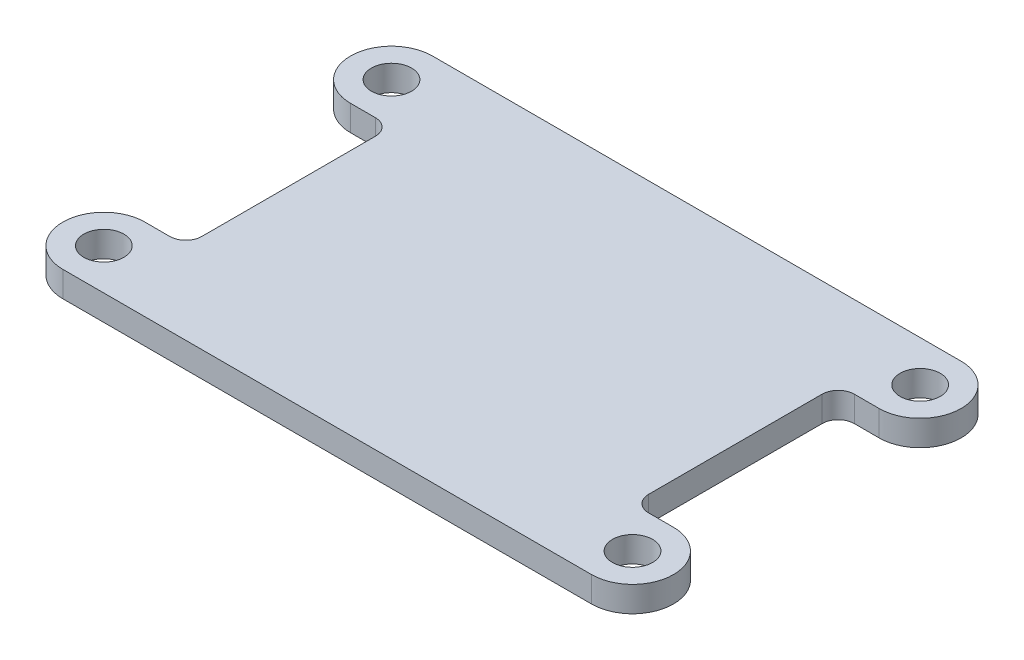
ISO-10303-21;
HEADER;
FILE_DESCRIPTION(('STEP AP214'),'2;1');
FILE_NAME('part.step','',(''),(''),'','','');
FILE_SCHEMA(('AUTOMOTIVE_DESIGN { 1 0 10303 214 1 1 1 1 }'));
ENDSEC;
DATA;
#1=APPLICATION_CONTEXT('core data for automotive mechanical design processes');
#2=APPLICATION_PROTOCOL_DEFINITION('international standard','automotive_design',2000,#1);
#3=PRODUCT_CONTEXT('',#1,'mechanical');
#4=PRODUCT('Part','Part','',(#3));
#5=PRODUCT_RELATED_PRODUCT_CATEGORY('part','',(#4));
#6=PRODUCT_DEFINITION_FORMATION('','',#4);
#7=PRODUCT_DEFINITION_CONTEXT('part definition',#1,'design');
#8=PRODUCT_DEFINITION('design','',#6,#7);
#9=PRODUCT_DEFINITION_SHAPE('','',#8);
#10=(LENGTH_UNIT() NAMED_UNIT(*) SI_UNIT(.MILLI.,.METRE.));
#11=(NAMED_UNIT(*) PLANE_ANGLE_UNIT() SI_UNIT($,.RADIAN.));
#12=(NAMED_UNIT(*) SI_UNIT($,.STERADIAN.) SOLID_ANGLE_UNIT());
#13=UNCERTAINTY_MEASURE_WITH_UNIT(LENGTH_MEASURE(1.E-05),#10,'distance_accuracy_value','');
#14=(GEOMETRIC_REPRESENTATION_CONTEXT(3) GLOBAL_UNCERTAINTY_ASSIGNED_CONTEXT((#13)) GLOBAL_UNIT_ASSIGNED_CONTEXT((#10,
#11,#12)) REPRESENTATION_CONTEXT('',''));
#15=CARTESIAN_POINT('',(0.,0.,0.));
#16=DIRECTION('',(0.,0.,1.));
#17=DIRECTION('',(1.,0.,0.));
#18=AXIS2_PLACEMENT_3D('',#15,#16,#17);
#19=CARTESIAN_POINT('',(0.,1.5875,0.));
#20=DIRECTION('',(0.,-1.,0.));
#21=DIRECTION('',(0.,0.,-1.));
#22=AXIS2_PLACEMENT_3D('',#19,#20,#21);
#23=PLANE('',#22);
#24=CARTESIAN_POINT('',(16.45,1.5875,-8.95));
#25=DIRECTION('',(0.,1.,0.));
#26=DIRECTION('',(0.,0.,1.));
#27=AXIS2_PLACEMENT_3D('',#24,#25,#26);
#28=CIRCLE('',#27,1.25);
#29=CARTESIAN_POINT('',(16.45,1.5875,-7.7));
#30=VERTEX_POINT('',#29);
#31=EDGE_CURVE('E455',#30,#30,#28,.F.);
#32=ORIENTED_EDGE('',*,*,#31,.T.);
#33=EDGE_LOOP('',(#32));
#34=FACE_BOUND('',#33,.T.);
#35=CARTESIAN_POINT('',(16.45,1.5875,8.95));
#36=DIRECTION('',(0.,1.,0.));
#37=DIRECTION('',(0.,0.,1.));
#38=AXIS2_PLACEMENT_3D('',#35,#36,#37);
#39=CIRCLE('',#38,1.25);
#40=CARTESIAN_POINT('',(16.45,1.5875,10.2));
#41=VERTEX_POINT('',#40);
#42=EDGE_CURVE('E402',#41,#41,#39,.F.);
#43=ORIENTED_EDGE('',*,*,#42,.T.);
#44=EDGE_LOOP('',(#43));
#45=FACE_BOUND('',#44,.T.);
#46=CARTESIAN_POINT('',(-16.45,1.5875,8.95));
#47=DIRECTION('',(0.,1.,0.));
#48=DIRECTION('',(0.,0.,1.));
#49=AXIS2_PLACEMENT_3D('',#46,#47,#48);
#50=CIRCLE('',#49,1.25);
#51=CARTESIAN_POINT('',(-16.45,1.5875,10.2));
#52=VERTEX_POINT('',#51);
#53=EDGE_CURVE('E393',#52,#52,#50,.T.);
#54=ORIENTED_EDGE('',*,*,#53,.F.);
#55=EDGE_LOOP('',(#54));
#56=FACE_BOUND('',#55,.T.);
#57=CARTESIAN_POINT('',(-16.45,1.5875,-8.95));
#58=DIRECTION('',(0.,1.,0.));
#59=DIRECTION('',(0.,0.,1.));
#60=AXIS2_PLACEMENT_3D('',#57,#58,#59);
#61=CIRCLE('',#60,1.25);
#62=CARTESIAN_POINT('',(-16.45,1.5875,-7.7));
#63=VERTEX_POINT('',#62);
#64=EDGE_CURVE('E382',#63,#63,#61,.T.);
#65=ORIENTED_EDGE('',*,*,#64,.F.);
#66=EDGE_LOOP('',(#65));
#67=FACE_BOUND('',#66,.T.);
#68=CARTESIAN_POINT('',(16.45,1.5875,-8.95));
#69=DIRECTION('',(0.,1.,0.));
#70=DIRECTION('',(0.,0.,1.));
#71=AXIS2_PLACEMENT_3D('',#68,#69,#70);
#72=CIRCLE('',#71,2.55);
#73=CARTESIAN_POINT('',(16.45,1.5875,-11.5));
#74=VERTEX_POINT('',#73);
#75=CARTESIAN_POINT('',(16.45,1.5875,-6.4));
#76=VERTEX_POINT('',#75);
#77=EDGE_CURVE('E438',#74,#76,#72,.F.);
#78=ORIENTED_EDGE('',*,*,#77,.F.);
#79=DIRECTION('',(-1.,0.,0.));
#80=VECTOR('',#79,1.);
#81=CARTESIAN_POINT('',(-19.,1.5875,-11.5));
#82=LINE('',#81,#80);
#83=CARTESIAN_POINT('',(-16.45,1.5875,-11.5));
#84=VERTEX_POINT('',#83);
#85=EDGE_CURVE('E204',#74,#84,#82,.T.);
#86=ORIENTED_EDGE('',*,*,#85,.T.);
#87=CARTESIAN_POINT('',(-16.45,1.5875,-8.95));
#88=DIRECTION('',(0.,1.,0.));
#89=DIRECTION('',(0.,0.,1.));
#90=AXIS2_PLACEMENT_3D('',#87,#88,#89);
#91=CIRCLE('',#90,2.55);
#92=CARTESIAN_POINT('',(-16.45,1.5875,-6.4));
#93=VERTEX_POINT('',#92);
#94=EDGE_CURVE('E331',#84,#93,#91,.T.);
#95=ORIENTED_EDGE('',*,*,#94,.T.);
#96=DIRECTION('',(1.,0.,0.));
#97=VECTOR('',#96,1.);
#98=CARTESIAN_POINT('',(0.,1.5875,-6.39999999999999));
#99=LINE('',#98,#97);
#100=CARTESIAN_POINT('',(-14.9,1.5875,-6.4));
#101=VERTEX_POINT('',#100);
#102=EDGE_CURVE('E365',#93,#101,#99,.T.);
#103=ORIENTED_EDGE('',*,*,#102,.T.);
#104=CARTESIAN_POINT('',(-14.9,1.5875,-5.4));
#105=DIRECTION('',(0.,1.,0.));
#106=DIRECTION('',(0.,0.,1.));
#107=AXIS2_PLACEMENT_3D('',#104,#105,#106);
#108=CIRCLE('',#107,1.);
#109=CARTESIAN_POINT('',(-13.9,1.5875,-5.39999999999999));
#110=VERTEX_POINT('',#109);
#111=EDGE_CURVE('E361',#101,#110,#108,.F.);
#112=ORIENTED_EDGE('',*,*,#111,.T.);
#113=DIRECTION('',(0.,0.,1.));
#114=VECTOR('',#113,1.);
#115=CARTESIAN_POINT('',(-13.9,1.5875,0.));
#116=LINE('',#115,#114);
#117=CARTESIAN_POINT('',(-13.9,1.5875,5.4));
#118=VERTEX_POINT('',#117);
#119=EDGE_CURVE('E351',#110,#118,#116,.T.);
#120=ORIENTED_EDGE('',*,*,#119,.T.);
#121=CARTESIAN_POINT('',(-14.9,1.5875,5.4));
#122=DIRECTION('',(0.,1.,0.));
#123=DIRECTION('',(0.,0.,1.));
#124=AXIS2_PLACEMENT_3D('',#121,#122,#123);
#125=CIRCLE('',#124,1.);
#126=CARTESIAN_POINT('',(-14.9,1.5875,6.4));
#127=VERTEX_POINT('',#126);
#128=EDGE_CURVE('E353',#118,#127,#125,.F.);
#129=ORIENTED_EDGE('',*,*,#128,.T.);
#130=DIRECTION('',(-1.,0.,0.));
#131=VECTOR('',#130,1.);
#132=CARTESIAN_POINT('',(0.,1.5875,6.4));
#133=LINE('',#132,#131);
#134=CARTESIAN_POINT('',(-16.45,1.5875,6.4));
#135=VERTEX_POINT('',#134);
#136=EDGE_CURVE('E372',#127,#135,#133,.T.);
#137=ORIENTED_EDGE('',*,*,#136,.T.);
#138=CARTESIAN_POINT('',(-16.45,1.5875,8.95));
#139=DIRECTION('',(0.,1.,0.));
#140=DIRECTION('',(0.,0.,1.));
#141=AXIS2_PLACEMENT_3D('',#138,#139,#140);
#142=CIRCLE('',#141,2.55);
#143=CARTESIAN_POINT('',(-16.45,1.5875,11.5));
#144=VERTEX_POINT('',#143);
#145=EDGE_CURVE('E369',#135,#144,#142,.T.);
#146=ORIENTED_EDGE('',*,*,#145,.T.);
#147=DIRECTION('',(1.,0.,0.));
#148=VECTOR('',#147,1.);
#149=CARTESIAN_POINT('',(-19.,1.5875,11.5));
#150=LINE('',#149,#148);
#151=CARTESIAN_POINT('',(16.45,1.5875,11.5));
#152=VERTEX_POINT('',#151);
#153=EDGE_CURVE('E12',#144,#152,#150,.T.);
#154=ORIENTED_EDGE('',*,*,#153,.T.);
#155=CARTESIAN_POINT('',(16.45,1.5875,8.95));
#156=DIRECTION('',(0.,1.,0.));
#157=DIRECTION('',(0.,0.,1.));
#158=AXIS2_PLACEMENT_3D('',#155,#156,#157);
#159=CIRCLE('',#158,2.55);
#160=CARTESIAN_POINT('',(16.45,1.5875,6.4));
#161=VERTEX_POINT('',#160);
#162=EDGE_CURVE('E319',#161,#152,#159,.F.);
#163=ORIENTED_EDGE('',*,*,#162,.F.);
#164=DIRECTION('',(1.,0.,0.));
#165=VECTOR('',#164,1.);
#166=CARTESIAN_POINT('',(0.,1.5875,6.4));
#167=LINE('',#166,#165);
#168=CARTESIAN_POINT('',(14.9,1.5875,6.4));
#169=VERTEX_POINT('',#168);
#170=EDGE_CURVE('E414',#169,#161,#167,.T.);
#171=ORIENTED_EDGE('',*,*,#170,.F.);
#172=CARTESIAN_POINT('',(14.9,1.5875,5.4));
#173=DIRECTION('',(0.,1.,0.));
#174=DIRECTION('',(0.,0.,1.));
#175=AXIS2_PLACEMENT_3D('',#172,#173,#174);
#176=CIRCLE('',#175,1.);
#177=CARTESIAN_POINT('',(13.9,1.5875,5.4));
#178=VERTEX_POINT('',#177);
#179=EDGE_CURVE('E426',#178,#169,#176,.T.);
#180=ORIENTED_EDGE('',*,*,#179,.F.);
#181=DIRECTION('',(0.,0.,1.));
#182=VECTOR('',#181,1.);
#183=CARTESIAN_POINT('',(13.9,1.5875,0.));
#184=LINE('',#183,#182);
#185=CARTESIAN_POINT('',(13.9,1.5875,-5.39999999999999));
#186=VERTEX_POINT('',#185);
#187=EDGE_CURVE('E429',#186,#178,#184,.T.);
#188=ORIENTED_EDGE('',*,*,#187,.F.);
#189=CARTESIAN_POINT('',(14.9,1.5875,-5.4));
#190=DIRECTION('',(0.,1.,0.));
#191=DIRECTION('',(0.,0.,1.));
#192=AXIS2_PLACEMENT_3D('',#189,#190,#191);
#193=CIRCLE('',#192,1.);
#194=CARTESIAN_POINT('',(14.9,1.5875,-6.4));
#195=VERTEX_POINT('',#194);
#196=EDGE_CURVE('E432',#195,#186,#193,.T.);
#197=ORIENTED_EDGE('',*,*,#196,.F.);
#198=DIRECTION('',(-1.,0.,0.));
#199=VECTOR('',#198,1.);
#200=CARTESIAN_POINT('',(0.,1.5875,-6.39999999999999));
#201=LINE('',#200,#199);
#202=EDGE_CURVE('E435',#76,#195,#201,.T.);
#203=ORIENTED_EDGE('',*,*,#202,.F.);
#204=EDGE_LOOP('',(#78,#86,#95,#103,#112,#120,#129,#137,#146,#154,#163,#171,#180,#188,#197,#203));
#205=FACE_BOUND('',#204,.T.);
#206=ADVANCED_FACE('F195',(#34,#45,#56,#67,#205),#23,.F.);
#207=CARTESIAN_POINT('',(0.,0.,0.));
#208=DIRECTION('',(0.,-1.,0.));
#209=DIRECTION('',(0.,0.,-1.));
#210=AXIS2_PLACEMENT_3D('',#207,#208,#209);
#211=PLANE('',#210);
#212=CARTESIAN_POINT('',(16.45,0.,-8.95));
#213=DIRECTION('',(0.,-1.,0.));
#214=DIRECTION('',(0.,0.,-1.));
#215=AXIS2_PLACEMENT_3D('',#212,#213,#214);
#216=CIRCLE('',#215,1.25);
#217=CARTESIAN_POINT('',(16.45,0.,-10.2));
#218=VERTEX_POINT('',#217);
#219=EDGE_CURVE('E323',#218,#218,#216,.T.);
#220=ORIENTED_EDGE('',*,*,#219,.F.);
#221=EDGE_LOOP('',(#220));
#222=FACE_BOUND('',#221,.T.);
#223=CARTESIAN_POINT('',(-16.45,0.,-8.95));
#224=DIRECTION('',(0.,-1.,0.));
#225=DIRECTION('',(0.,0.,-1.));
#226=AXIS2_PLACEMENT_3D('',#223,#224,#225);
#227=CIRCLE('',#226,1.25);
#228=CARTESIAN_POINT('',(-16.45,0.,-10.2));
#229=VERTEX_POINT('',#228);
#230=EDGE_CURVE('E387',#229,#229,#227,.F.);
#231=ORIENTED_EDGE('',*,*,#230,.T.);
#232=EDGE_LOOP('',(#231));
#233=FACE_BOUND('',#232,.T.);
#234=CARTESIAN_POINT('',(-16.45,0.,8.95));
#235=DIRECTION('',(0.,-1.,0.));
#236=DIRECTION('',(0.,0.,-1.));
#237=AXIS2_PLACEMENT_3D('',#234,#235,#236);
#238=CIRCLE('',#237,1.25);
#239=CARTESIAN_POINT('',(-16.45,0.,7.7));
#240=VERTEX_POINT('',#239);
#241=EDGE_CURVE('E394',#240,#240,#238,.F.);
#242=ORIENTED_EDGE('',*,*,#241,.T.);
#243=EDGE_LOOP('',(#242));
#244=FACE_BOUND('',#243,.T.);
#245=CARTESIAN_POINT('',(16.45,0.,8.95));
#246=DIRECTION('',(0.,-1.,0.));
#247=DIRECTION('',(0.,0.,-1.));
#248=AXIS2_PLACEMENT_3D('',#245,#246,#247);
#249=CIRCLE('',#248,1.25);
#250=CARTESIAN_POINT('',(16.45,0.,7.7));
#251=VERTEX_POINT('',#250);
#252=EDGE_CURVE('E397',#251,#251,#249,.T.);
#253=ORIENTED_EDGE('',*,*,#252,.F.);
#254=EDGE_LOOP('',(#253));
#255=FACE_BOUND('',#254,.T.);
#256=DIRECTION('',(-1.,0.,0.));
#257=VECTOR('',#256,1.);
#258=CARTESIAN_POINT('',(-19.,0.,-11.5));
#259=LINE('',#258,#257);
#260=CARTESIAN_POINT('',(16.45,0.,-11.5));
#261=VERTEX_POINT('',#260);
#262=CARTESIAN_POINT('',(-16.45,0.,-11.5));
#263=VERTEX_POINT('',#262);
#264=EDGE_CURVE('E212',#261,#263,#259,.T.);
#265=ORIENTED_EDGE('',*,*,#264,.F.);
#266=CARTESIAN_POINT('',(16.45,0.,-8.95));
#267=DIRECTION('',(0.,-1.,0.));
#268=DIRECTION('',(0.,0.,-1.));
#269=AXIS2_PLACEMENT_3D('',#266,#267,#268);
#270=CIRCLE('',#269,2.55);
#271=CARTESIAN_POINT('',(16.45,0.,-6.4));
#272=VERTEX_POINT('',#271);
#273=EDGE_CURVE('E312',#261,#272,#270,.T.);
#274=ORIENTED_EDGE('',*,*,#273,.T.);
#275=DIRECTION('',(-1.,0.,0.));
#276=VECTOR('',#275,1.);
#277=CARTESIAN_POINT('',(0.,0.,-6.39999999999999));
#278=LINE('',#277,#276);
#279=CARTESIAN_POINT('',(14.9,0.,-6.4));
#280=VERTEX_POINT('',#279);
#281=EDGE_CURVE('E322',#272,#280,#278,.T.);
#282=ORIENTED_EDGE('',*,*,#281,.T.);
#283=CARTESIAN_POINT('',(14.9,0.,-5.4));
#284=DIRECTION('',(0.,-1.,0.));
#285=DIRECTION('',(0.,0.,-1.));
#286=AXIS2_PLACEMENT_3D('',#283,#284,#285);
#287=CIRCLE('',#286,1.);
#288=CARTESIAN_POINT('',(13.9,0.,-5.39999999999999));
#289=VERTEX_POINT('',#288);
#290=EDGE_CURVE('E449',#280,#289,#287,.F.);
#291=ORIENTED_EDGE('',*,*,#290,.T.);
#292=DIRECTION('',(0.,0.,1.));
#293=VECTOR('',#292,1.);
#294=CARTESIAN_POINT('',(13.9,0.,0.));
#295=LINE('',#294,#293);
#296=CARTESIAN_POINT('',(13.9,0.,5.4));
#297=VERTEX_POINT('',#296);
#298=EDGE_CURVE('E446',#289,#297,#295,.T.);
#299=ORIENTED_EDGE('',*,*,#298,.T.);
#300=CARTESIAN_POINT('',(14.9,0.,5.4));
#301=DIRECTION('',(0.,-1.,0.));
#302=DIRECTION('',(0.,0.,-1.));
#303=AXIS2_PLACEMENT_3D('',#300,#301,#302);
#304=CIRCLE('',#303,1.);
#305=CARTESIAN_POINT('',(14.9,0.,6.4));
#306=VERTEX_POINT('',#305);
#307=EDGE_CURVE('E443',#297,#306,#304,.F.);
#308=ORIENTED_EDGE('',*,*,#307,.T.);
#309=DIRECTION('',(1.,0.,0.));
#310=VECTOR('',#309,1.);
#311=CARTESIAN_POINT('',(0.,0.,6.4));
#312=LINE('',#311,#310);
#313=CARTESIAN_POINT('',(16.45,0.,6.4));
#314=VERTEX_POINT('',#313);
#315=EDGE_CURVE('E440',#306,#314,#312,.T.);
#316=ORIENTED_EDGE('',*,*,#315,.T.);
#317=CARTESIAN_POINT('',(16.45,0.,8.95));
#318=DIRECTION('',(0.,-1.,0.));
#319=DIRECTION('',(0.,0.,-1.));
#320=AXIS2_PLACEMENT_3D('',#317,#318,#319);
#321=CIRCLE('',#320,2.55);
#322=CARTESIAN_POINT('',(16.45,0.,11.5));
#323=VERTEX_POINT('',#322);
#324=EDGE_CURVE('E405',#314,#323,#321,.T.);
#325=ORIENTED_EDGE('',*,*,#324,.T.);
#326=DIRECTION('',(1.,0.,0.));
#327=VECTOR('',#326,1.);
#328=CARTESIAN_POINT('',(-19.,0.,11.5));
#329=LINE('',#328,#327);
#330=CARTESIAN_POINT('',(-16.45,0.,11.5));
#331=VERTEX_POINT('',#330);
#332=EDGE_CURVE('E199',#331,#323,#329,.T.);
#333=ORIENTED_EDGE('',*,*,#332,.F.);
#334=CARTESIAN_POINT('',(-16.45,0.,8.95));
#335=DIRECTION('',(0.,-1.,0.));
#336=DIRECTION('',(0.,0.,-1.));
#337=AXIS2_PLACEMENT_3D('',#334,#335,#336);
#338=CIRCLE('',#337,2.55);
#339=CARTESIAN_POINT('',(-16.45,0.,6.4));
#340=VERTEX_POINT('',#339);
#341=EDGE_CURVE('E345',#340,#331,#338,.F.);
#342=ORIENTED_EDGE('',*,*,#341,.F.);
#343=DIRECTION('',(-1.,0.,0.));
#344=VECTOR('',#343,1.);
#345=CARTESIAN_POINT('',(0.,0.,6.4));
#346=LINE('',#345,#344);
#347=CARTESIAN_POINT('',(-14.9,0.,6.4));
#348=VERTEX_POINT('',#347);
#349=EDGE_CURVE('E348',#348,#340,#346,.T.);
#350=ORIENTED_EDGE('',*,*,#349,.F.);
#351=CARTESIAN_POINT('',(-14.9,0.,5.4));
#352=DIRECTION('',(0.,-1.,0.));
#353=DIRECTION('',(0.,0.,-1.));
#354=AXIS2_PLACEMENT_3D('',#351,#352,#353);
#355=CIRCLE('',#354,1.);
#356=CARTESIAN_POINT('',(-13.9,0.,5.4));
#357=VERTEX_POINT('',#356);
#358=EDGE_CURVE('E337',#357,#348,#355,.T.);
#359=ORIENTED_EDGE('',*,*,#358,.F.);
#360=DIRECTION('',(0.,0.,1.));
#361=VECTOR('',#360,1.);
#362=CARTESIAN_POINT('',(-13.9,0.,0.));
#363=LINE('',#362,#361);
#364=CARTESIAN_POINT('',(-13.9,0.,-5.39999999999999));
#365=VERTEX_POINT('',#364);
#366=EDGE_CURVE('E341',#365,#357,#363,.T.);
#367=ORIENTED_EDGE('',*,*,#366,.F.);
#368=CARTESIAN_POINT('',(-14.9,0.,-5.4));
#369=DIRECTION('',(0.,-1.,0.));
#370=DIRECTION('',(0.,0.,-1.));
#371=AXIS2_PLACEMENT_3D('',#368,#369,#370);
#372=CIRCLE('',#371,1.);
#373=CARTESIAN_POINT('',(-14.9,0.,-6.4));
#374=VERTEX_POINT('',#373);
#375=EDGE_CURVE('E338',#374,#365,#372,.T.);
#376=ORIENTED_EDGE('',*,*,#375,.F.);
#377=DIRECTION('',(1.,0.,0.));
#378=VECTOR('',#377,1.);
#379=CARTESIAN_POINT('',(0.,0.,-6.39999999999999));
#380=LINE('',#379,#378);
#381=CARTESIAN_POINT('',(-16.45,0.,-6.4));
#382=VERTEX_POINT('',#381);
#383=EDGE_CURVE('E342',#382,#374,#380,.T.);
#384=ORIENTED_EDGE('',*,*,#383,.F.);
#385=CARTESIAN_POINT('',(-16.45,0.,-8.95));
#386=DIRECTION('',(0.,-1.,0.));
#387=DIRECTION('',(0.,0.,-1.));
#388=AXIS2_PLACEMENT_3D('',#385,#386,#387);
#389=CIRCLE('',#388,2.55);
#390=EDGE_CURVE('E328',#263,#382,#389,.F.);
#391=ORIENTED_EDGE('',*,*,#390,.F.);
#392=EDGE_LOOP('',(#265,#274,#282,#291,#299,#308,#316,#325,#333,#342,#350,#359,#367,#376,#384,#391));
#393=FACE_BOUND('',#392,.T.);
#394=ADVANCED_FACE('F326',(#222,#233,#244,#255,#393),#211,.T.);
#395=CARTESIAN_POINT('',(-19.,1.5875,11.5));
#396=DIRECTION('',(0.,0.,-1.));
#397=DIRECTION('',(-1.,0.,0.));
#398=AXIS2_PLACEMENT_3D('',#395,#396,#397);
#399=PLANE('',#398);
#400=DIRECTION('',(0.,1.,0.));
#401=VECTOR('',#400,1.);
#402=CARTESIAN_POINT('',(16.45,-0.000999999999999916,11.5));
#403=LINE('',#402,#401);
#404=EDGE_CURVE('E408',#323,#152,#403,.T.);
#405=ORIENTED_EDGE('',*,*,#404,.T.);
#406=ORIENTED_EDGE('',*,*,#153,.F.);
#407=DIRECTION('',(0.,1.,0.));
#408=VECTOR('',#407,1.);
#409=CARTESIAN_POINT('',(-16.45,-0.000999999999999916,11.5));
#410=LINE('',#409,#408);
#411=EDGE_CURVE('E390',#331,#144,#410,.T.);
#412=ORIENTED_EDGE('',*,*,#411,.F.);
#413=ORIENTED_EDGE('',*,*,#332,.T.);
#414=EDGE_LOOP('',(#405,#406,#412,#413));
#415=FACE_BOUND('',#414,.T.);
#416=ADVANCED_FACE('F476',(#415),#399,.F.);
#417=CARTESIAN_POINT('',(-19.,1.5875,-11.5));
#418=DIRECTION('',(0.,0.,1.));
#419=DIRECTION('',(1.,0.,0.));
#420=AXIS2_PLACEMENT_3D('',#417,#418,#419);
#421=PLANE('',#420);
#422=ORIENTED_EDGE('',*,*,#85,.F.);
#423=DIRECTION('',(0.,1.,0.));
#424=VECTOR('',#423,1.);
#425=CARTESIAN_POINT('',(16.45,-0.000999999999999916,-11.5));
#426=LINE('',#425,#424);
#427=EDGE_CURVE('E315',#261,#74,#426,.T.);
#428=ORIENTED_EDGE('',*,*,#427,.F.);
#429=ORIENTED_EDGE('',*,*,#264,.T.);
#430=DIRECTION('',(0.,1.,0.));
#431=VECTOR('',#430,1.);
#432=CARTESIAN_POINT('',(-16.45,-0.000999999999999916,-11.5));
#433=LINE('',#432,#431);
#434=EDGE_CURVE('E329',#263,#84,#433,.T.);
#435=ORIENTED_EDGE('',*,*,#434,.T.);
#436=EDGE_LOOP('',(#422,#428,#429,#435));
#437=FACE_BOUND('',#436,.T.);
#438=ADVANCED_FACE('F197',(#437),#421,.F.);
#439=CARTESIAN_POINT('',(-16.45,-0.000999999999999916,-8.95));
#440=DIRECTION('',(0.,1.,0.));
#441=DIRECTION('',(0.,0.,1.));
#442=AXIS2_PLACEMENT_3D('',#439,#440,#441);
#443=CYLINDRICAL_SURFACE('',#442,2.55);
#444=ORIENTED_EDGE('',*,*,#390,.T.);
#445=DIRECTION('',(0.,1.,0.));
#446=VECTOR('',#445,1.);
#447=CARTESIAN_POINT('',(-16.45,-0.000999999999999916,-6.4));
#448=LINE('',#447,#446);
#449=EDGE_CURVE('E368',#382,#93,#448,.T.);
#450=ORIENTED_EDGE('',*,*,#449,.T.);
#451=ORIENTED_EDGE('',*,*,#94,.F.);
#452=ORIENTED_EDGE('',*,*,#434,.F.);
#453=EDGE_LOOP('',(#444,#450,#451,#452));
#454=FACE_BOUND('',#453,.T.);
#455=ADVANCED_FACE('F480',(#454),#443,.T.);
#456=CARTESIAN_POINT('',(-14.9,-0.000999999999999916,5.4));
#457=DIRECTION('',(0.,1.,0.));
#458=DIRECTION('',(0.,0.,1.));
#459=AXIS2_PLACEMENT_3D('',#456,#457,#458);
#460=CYLINDRICAL_SURFACE('',#459,1.);
#461=ORIENTED_EDGE('',*,*,#358,.T.);
#462=DIRECTION('',(0.,1.,0.));
#463=VECTOR('',#462,1.);
#464=CARTESIAN_POINT('',(-14.9,-0.000999999999999916,6.4));
#465=LINE('',#464,#463);
#466=EDGE_CURVE('E356',#348,#127,#465,.T.);
#467=ORIENTED_EDGE('',*,*,#466,.T.);
#468=ORIENTED_EDGE('',*,*,#128,.F.);
#469=DIRECTION('',(0.,1.,0.));
#470=VECTOR('',#469,1.);
#471=CARTESIAN_POINT('',(-13.9,-0.000999999999999916,5.4));
#472=LINE('',#471,#470);
#473=EDGE_CURVE('E357',#357,#118,#472,.T.);
#474=ORIENTED_EDGE('',*,*,#473,.F.);
#475=EDGE_LOOP('',(#461,#467,#468,#474));
#476=FACE_BOUND('',#475,.T.);
#477=ADVANCED_FACE('F541',(#476),#460,.F.);
#478=CARTESIAN_POINT('',(0.,-0.000999999999999916,6.4));
#479=DIRECTION('',(0.,0.,-1.));
#480=DIRECTION('',(-1.,0.,0.));
#481=AXIS2_PLACEMENT_3D('',#478,#479,#480);
#482=PLANE('',#481);
#483=ORIENTED_EDGE('',*,*,#349,.T.);
#484=DIRECTION('',(0.,1.,0.));
#485=VECTOR('',#484,1.);
#486=CARTESIAN_POINT('',(-16.45,-0.000999999999999916,6.4));
#487=LINE('',#486,#485);
#488=EDGE_CURVE('E371',#340,#135,#487,.T.);
#489=ORIENTED_EDGE('',*,*,#488,.T.);
#490=ORIENTED_EDGE('',*,*,#136,.F.);
#491=ORIENTED_EDGE('',*,*,#466,.F.);
#492=EDGE_LOOP('',(#483,#489,#490,#491));
#493=FACE_BOUND('',#492,.T.);
#494=ADVANCED_FACE('F544',(#493),#482,.T.);
#495=CARTESIAN_POINT('',(-16.45,-0.000999999999999916,8.95));
#496=DIRECTION('',(0.,1.,0.));
#497=DIRECTION('',(0.,0.,1.));
#498=AXIS2_PLACEMENT_3D('',#495,#496,#497);
#499=CYLINDRICAL_SURFACE('',#498,2.55);
#500=ORIENTED_EDGE('',*,*,#341,.T.);
#501=ORIENTED_EDGE('',*,*,#411,.T.);
#502=ORIENTED_EDGE('',*,*,#145,.F.);
#503=ORIENTED_EDGE('',*,*,#488,.F.);
#504=EDGE_LOOP('',(#500,#501,#502,#503));
#505=FACE_BOUND('',#504,.T.);
#506=ADVANCED_FACE('F496',(#505),#499,.T.);
#507=CARTESIAN_POINT('',(0.,-0.000999999999999916,-6.39999999999999));
#508=DIRECTION('',(0.,0.,1.));
#509=DIRECTION('',(1.,0.,0.));
#510=AXIS2_PLACEMENT_3D('',#507,#508,#509);
#511=PLANE('',#510);
#512=ORIENTED_EDGE('',*,*,#383,.T.);
#513=DIRECTION('',(0.,1.,0.));
#514=VECTOR('',#513,1.);
#515=CARTESIAN_POINT('',(-14.9,-0.000999999999999916,-6.4));
#516=LINE('',#515,#514);
#517=EDGE_CURVE('E364',#374,#101,#516,.T.);
#518=ORIENTED_EDGE('',*,*,#517,.T.);
#519=ORIENTED_EDGE('',*,*,#102,.F.);
#520=ORIENTED_EDGE('',*,*,#449,.F.);
#521=EDGE_LOOP('',(#512,#518,#519,#520));
#522=FACE_BOUND('',#521,.T.);
#523=ADVANCED_FACE('F552',(#522),#511,.T.);
#524=CARTESIAN_POINT('',(-14.9,-0.000999999999999916,-5.4));
#525=DIRECTION('',(0.,1.,0.));
#526=DIRECTION('',(0.,0.,1.));
#527=AXIS2_PLACEMENT_3D('',#524,#525,#526);
#528=CYLINDRICAL_SURFACE('',#527,1.);
#529=ORIENTED_EDGE('',*,*,#375,.T.);
#530=DIRECTION('',(0.,1.,0.));
#531=VECTOR('',#530,1.);
#532=CARTESIAN_POINT('',(-13.9,-0.000999999999999916,-5.39999999999999));
#533=LINE('',#532,#531);
#534=EDGE_CURVE('E360',#365,#110,#533,.T.);
#535=ORIENTED_EDGE('',*,*,#534,.T.);
#536=ORIENTED_EDGE('',*,*,#111,.F.);
#537=ORIENTED_EDGE('',*,*,#517,.F.);
#538=EDGE_LOOP('',(#529,#535,#536,#537));
#539=FACE_BOUND('',#538,.T.);
#540=ADVANCED_FACE('F548',(#539),#528,.F.);
#541=CARTESIAN_POINT('',(-13.9,-0.000999999999999916,0.));
#542=DIRECTION('',(-1.,0.,0.));
#543=DIRECTION('',(0.,0.,1.));
#544=AXIS2_PLACEMENT_3D('',#541,#542,#543);
#545=PLANE('',#544);
#546=ORIENTED_EDGE('',*,*,#366,.T.);
#547=ORIENTED_EDGE('',*,*,#473,.T.);
#548=ORIENTED_EDGE('',*,*,#119,.F.);
#549=ORIENTED_EDGE('',*,*,#534,.F.);
#550=EDGE_LOOP('',(#546,#547,#548,#549));
#551=FACE_BOUND('',#550,.T.);
#552=ADVANCED_FACE('F539',(#551),#545,.T.);
#553=CARTESIAN_POINT('',(-16.45,-0.000999999999999916,-8.95));
#554=DIRECTION('',(0.,1.,0.));
#555=DIRECTION('',(0.,0.,1.));
#556=AXIS2_PLACEMENT_3D('',#553,#554,#555);
#557=CYLINDRICAL_SURFACE('',#556,1.25);
#558=ORIENTED_EDGE('',*,*,#230,.F.);
#559=EDGE_LOOP('',(#558));
#560=FACE_BOUND('',#559,.T.);
#561=ORIENTED_EDGE('',*,*,#64,.T.);
#562=EDGE_LOOP('',(#561));
#563=FACE_BOUND('',#562,.T.);
#564=ADVANCED_FACE('F535',(#560,#563),#557,.F.);
#565=CARTESIAN_POINT('',(-16.45,-0.000999999999999916,8.95));
#566=DIRECTION('',(0.,1.,0.));
#567=DIRECTION('',(0.,0.,1.));
#568=AXIS2_PLACEMENT_3D('',#565,#566,#567);
#569=CYLINDRICAL_SURFACE('',#568,1.25);
#570=ORIENTED_EDGE('',*,*,#241,.F.);
#571=EDGE_LOOP('',(#570));
#572=FACE_BOUND('',#571,.T.);
#573=ORIENTED_EDGE('',*,*,#53,.T.);
#574=EDGE_LOOP('',(#573));
#575=FACE_BOUND('',#574,.T.);
#576=ADVANCED_FACE('F529',(#572,#575),#569,.F.);
#577=CARTESIAN_POINT('',(16.45,-0.000999999999999916,8.95));
#578=DIRECTION('',(0.,1.,0.));
#579=DIRECTION('',(0.,0.,1.));
#580=AXIS2_PLACEMENT_3D('',#577,#578,#579);
#581=CYLINDRICAL_SURFACE('',#580,2.55);
#582=ORIENTED_EDGE('',*,*,#324,.F.);
#583=DIRECTION('',(0.,1.,0.));
#584=VECTOR('',#583,1.);
#585=CARTESIAN_POINT('',(16.45,-0.000999999999999916,6.4));
#586=LINE('',#585,#584);
#587=EDGE_CURVE('E320',#314,#161,#586,.T.);
#588=ORIENTED_EDGE('',*,*,#587,.T.);
#589=ORIENTED_EDGE('',*,*,#162,.T.);
#590=ORIENTED_EDGE('',*,*,#404,.F.);
#591=EDGE_LOOP('',(#582,#588,#589,#590));
#592=FACE_BOUND('',#591,.T.);
#593=ADVANCED_FACE('F500',(#592),#581,.T.);
#594=CARTESIAN_POINT('',(16.45,-0.000999999999999916,8.95));
#595=DIRECTION('',(0.,1.,0.));
#596=DIRECTION('',(0.,0.,1.));
#597=AXIS2_PLACEMENT_3D('',#594,#595,#596);
#598=CYLINDRICAL_SURFACE('',#597,1.25);
#599=ORIENTED_EDGE('',*,*,#252,.T.);
#600=EDGE_LOOP('',(#599));
#601=FACE_BOUND('',#600,.T.);
#602=ORIENTED_EDGE('',*,*,#42,.F.);
#603=EDGE_LOOP('',(#602));
#604=FACE_BOUND('',#603,.T.);
#605=ADVANCED_FACE('F528',(#601,#604),#598,.F.);
#606=CARTESIAN_POINT('',(0.,-0.000999999999999916,6.4));
#607=DIRECTION('',(0.,0.,1.));
#608=DIRECTION('',(1.,0.,0.));
#609=AXIS2_PLACEMENT_3D('',#606,#607,#608);
#610=PLANE('',#609);
#611=DIRECTION('',(0.,1.,0.));
#612=VECTOR('',#611,1.);
#613=CARTESIAN_POINT('',(14.9,-0.000999999999999916,6.4));
#614=LINE('',#613,#612);
#615=EDGE_CURVE('E420',#306,#169,#614,.T.);
#616=ORIENTED_EDGE('',*,*,#615,.T.);
#617=ORIENTED_EDGE('',*,*,#170,.T.);
#618=ORIENTED_EDGE('',*,*,#587,.F.);
#619=ORIENTED_EDGE('',*,*,#315,.F.);
#620=EDGE_LOOP('',(#616,#617,#618,#619));
#621=FACE_BOUND('',#620,.T.);
#622=ADVANCED_FACE('F502',(#621),#610,.F.);
#623=CARTESIAN_POINT('',(14.9,-0.000999999999999916,5.4));
#624=DIRECTION('',(0.,1.,0.));
#625=DIRECTION('',(0.,0.,1.));
#626=AXIS2_PLACEMENT_3D('',#623,#624,#625);
#627=CYLINDRICAL_SURFACE('',#626,1.);
#628=DIRECTION('',(0.,1.,0.));
#629=VECTOR('',#628,1.);
#630=CARTESIAN_POINT('',(13.9,-0.000999999999999916,5.4));
#631=LINE('',#630,#629);
#632=EDGE_CURVE('E418',#297,#178,#631,.T.);
#633=ORIENTED_EDGE('',*,*,#632,.T.);
#634=ORIENTED_EDGE('',*,*,#179,.T.);
#635=ORIENTED_EDGE('',*,*,#615,.F.);
#636=ORIENTED_EDGE('',*,*,#307,.F.);
#637=EDGE_LOOP('',(#633,#634,#635,#636));
#638=FACE_BOUND('',#637,.T.);
#639=ADVANCED_FACE('F508',(#638),#627,.F.);
#640=CARTESIAN_POINT('',(13.9,-0.000999999999999916,0.));
#641=DIRECTION('',(-1.,0.,0.));
#642=DIRECTION('',(0.,0.,1.));
#643=AXIS2_PLACEMENT_3D('',#640,#641,#642);
#644=PLANE('',#643);
#645=DIRECTION('',(0.,1.,0.));
#646=VECTOR('',#645,1.);
#647=CARTESIAN_POINT('',(13.9,-0.000999999999999916,-5.39999999999999));
#648=LINE('',#647,#646);
#649=EDGE_CURVE('E416',#289,#186,#648,.T.);
#650=ORIENTED_EDGE('',*,*,#649,.T.);
#651=ORIENTED_EDGE('',*,*,#187,.T.);
#652=ORIENTED_EDGE('',*,*,#632,.F.);
#653=ORIENTED_EDGE('',*,*,#298,.F.);
#654=EDGE_LOOP('',(#650,#651,#652,#653));
#655=FACE_BOUND('',#654,.T.);
#656=ADVANCED_FACE('F511',(#655),#644,.F.);
#657=CARTESIAN_POINT('',(14.9,-0.000999999999999916,-5.4));
#658=DIRECTION('',(0.,1.,0.));
#659=DIRECTION('',(0.,0.,1.));
#660=AXIS2_PLACEMENT_3D('',#657,#658,#659);
#661=CYLINDRICAL_SURFACE('',#660,1.);
#662=DIRECTION('',(0.,1.,0.));
#663=VECTOR('',#662,1.);
#664=CARTESIAN_POINT('',(14.9,-0.000999999999999916,-6.4));
#665=LINE('',#664,#663);
#666=EDGE_CURVE('E413',#280,#195,#665,.T.);
#667=ORIENTED_EDGE('',*,*,#666,.T.);
#668=ORIENTED_EDGE('',*,*,#196,.T.);
#669=ORIENTED_EDGE('',*,*,#649,.F.);
#670=ORIENTED_EDGE('',*,*,#290,.F.);
#671=EDGE_LOOP('',(#667,#668,#669,#670));
#672=FACE_BOUND('',#671,.T.);
#673=ADVANCED_FACE('F514',(#672),#661,.F.);
#674=CARTESIAN_POINT('',(0.,-0.000999999999999916,-6.39999999999999));
#675=DIRECTION('',(0.,0.,-1.));
#676=DIRECTION('',(-1.,0.,0.));
#677=AXIS2_PLACEMENT_3D('',#674,#675,#676);
#678=PLANE('',#677);
#679=DIRECTION('',(0.,1.,0.));
#680=VECTOR('',#679,1.);
#681=CARTESIAN_POINT('',(16.45,-0.000999999999999916,-6.4));
#682=LINE('',#681,#680);
#683=EDGE_CURVE('E316',#272,#76,#682,.T.);
#684=ORIENTED_EDGE('',*,*,#683,.T.);
#685=ORIENTED_EDGE('',*,*,#202,.T.);
#686=ORIENTED_EDGE('',*,*,#666,.F.);
#687=ORIENTED_EDGE('',*,*,#281,.F.);
#688=EDGE_LOOP('',(#684,#685,#686,#687));
#689=FACE_BOUND('',#688,.T.);
#690=ADVANCED_FACE('F468',(#689),#678,.F.);
#691=CARTESIAN_POINT('',(16.45,-0.000999999999999916,-8.95));
#692=DIRECTION('',(0.,1.,0.));
#693=DIRECTION('',(0.,0.,1.));
#694=AXIS2_PLACEMENT_3D('',#691,#692,#693);
#695=CYLINDRICAL_SURFACE('',#694,2.55);
#696=ORIENTED_EDGE('',*,*,#273,.F.);
#697=ORIENTED_EDGE('',*,*,#427,.T.);
#698=ORIENTED_EDGE('',*,*,#77,.T.);
#699=ORIENTED_EDGE('',*,*,#683,.F.);
#700=EDGE_LOOP('',(#696,#697,#698,#699));
#701=FACE_BOUND('',#700,.T.);
#702=ADVANCED_FACE('F313',(#701),#695,.T.);
#703=CARTESIAN_POINT('',(16.45,-0.000999999999999916,-8.95));
#704=DIRECTION('',(0.,1.,0.));
#705=DIRECTION('',(0.,0.,1.));
#706=AXIS2_PLACEMENT_3D('',#703,#704,#705);
#707=CYLINDRICAL_SURFACE('',#706,1.25);
#708=ORIENTED_EDGE('',*,*,#219,.T.);
#709=EDGE_LOOP('',(#708));
#710=FACE_BOUND('',#709,.T.);
#711=ORIENTED_EDGE('',*,*,#31,.F.);
#712=EDGE_LOOP('',(#711));
#713=FACE_BOUND('',#712,.T.);
#714=ADVANCED_FACE('F461',(#710,#713),#707,.F.);
#715=CLOSED_SHELL('',(#206,#394,#416,#438,#455,#477,#494,#506,#523,#540,#552,#564,#576,#593,
#605,#622,#639,#656,#673,#690,#702,#714));
#716=MANIFOLD_SOLID_BREP('B2',#715);
#717=ADVANCED_BREP_SHAPE_REPRESENTATION('',(#18,#716),#14);
#718=SHAPE_DEFINITION_REPRESENTATION(#9,#717);
ENDSEC;
END-ISO-10303-21;
